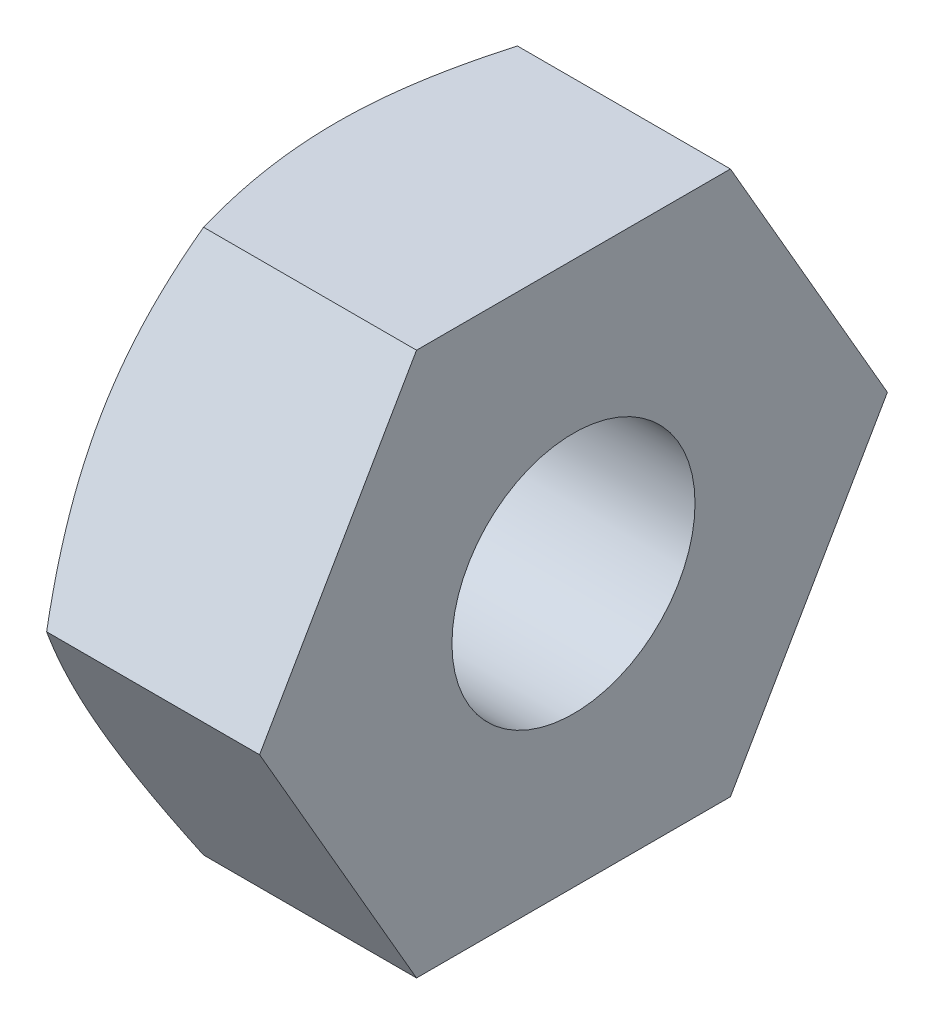
ISO-10303-21;
HEADER;
FILE_DESCRIPTION(('STEP AP214'),'2;1');
FILE_NAME('part.step','',(''),(''),'','','');
FILE_SCHEMA(('AUTOMOTIVE_DESIGN { 1 0 10303 214 1 1 1 1 }'));
ENDSEC;
DATA;
#1=APPLICATION_CONTEXT('core data for automotive mechanical design processes');
#2=APPLICATION_PROTOCOL_DEFINITION('international standard','automotive_design',2000,#1);
#3=PRODUCT_CONTEXT('',#1,'mechanical');
#4=PRODUCT('Part','Part','',(#3));
#5=PRODUCT_RELATED_PRODUCT_CATEGORY('part','',(#4));
#6=PRODUCT_DEFINITION_FORMATION('','',#4);
#7=PRODUCT_DEFINITION_CONTEXT('part definition',#1,'design');
#8=PRODUCT_DEFINITION('design','',#6,#7);
#9=PRODUCT_DEFINITION_SHAPE('','',#8);
#10=(LENGTH_UNIT() NAMED_UNIT(*) SI_UNIT(.MILLI.,.METRE.));
#11=(NAMED_UNIT(*) PLANE_ANGLE_UNIT() SI_UNIT($,.RADIAN.));
#12=(NAMED_UNIT(*) SI_UNIT($,.STERADIAN.) SOLID_ANGLE_UNIT());
#13=UNCERTAINTY_MEASURE_WITH_UNIT(LENGTH_MEASURE(1.E-05),#10,'distance_accuracy_value','');
#14=(GEOMETRIC_REPRESENTATION_CONTEXT(3) GLOBAL_UNCERTAINTY_ASSIGNED_CONTEXT((#13)) GLOBAL_UNIT_ASSIGNED_CONTEXT((#10,
#11,#12)) REPRESENTATION_CONTEXT('',''));
#15=CARTESIAN_POINT('',(0.,0.,0.));
#16=DIRECTION('',(0.,0.,1.));
#17=DIRECTION('',(1.,0.,0.));
#18=AXIS2_PLACEMENT_3D('',#15,#16,#17);
#19=CARTESIAN_POINT('',(-2.4,-2.75,-1.58771324027147));
#20=DIRECTION('',(0.,-0.5,-0.866025403784439));
#21=DIRECTION('',(0.,0.866025403784439,-0.5));
#22=AXIS2_PLACEMENT_3D('',#19,#20,#21);
#23=PLANE('',#22);
#24=DIRECTION('',(1.,0.,0.));
#25=VECTOR('',#24,1.);
#26=CARTESIAN_POINT('',(-2.4,-2.75,-1.58771324027147));
#27=LINE('',#26,#25);
#28=CARTESIAN_POINT('',(-2.15437990693814,-2.75,-1.58771324027147));
#29=VERTEX_POINT('',#28);
#30=CARTESIAN_POINT('',(0.,-2.75,-1.58771324027147));
#31=VERTEX_POINT('',#30);
#32=EDGE_CURVE('E110',#29,#31,#27,.T.);
#33=ORIENTED_EDGE('',*,*,#32,.F.);
#34=CARTESIAN_POINT('',(-2.15431323663524,-2.7502,-1.58759777021763));
#35=CARTESIAN_POINT('',(-2.19461233775074,-2.62935077934009,-1.65737010029699));
#36=CARTESIAN_POINT('',(-2.23126309740234,-2.50745839737736,-1.72774469983533));
#37=CARTESIAN_POINT('',(-2.2952378170302,-2.26156287327211,-1.86971254687003));
#38=CARTESIAN_POINT('',(-2.3225391443255,-2.13755536142614,-1.94130831721583));
#39=CARTESIAN_POINT('',(-2.36503825470588,-1.89107720202405,-2.08361254889599));
#40=CARTESIAN_POINT('',(-2.38051888137754,-1.76864448141258,-2.15429911309864));
#41=CARTESIAN_POINT('',(-2.39900060263006,-1.52320285763108,-2.29600490065923));
#42=CARTESIAN_POINT('',(-2.4020170005374,-1.40019484676709,-2.36702360884404));
#43=CARTESIAN_POINT('',(-2.39574685457145,-1.17034121338921,-2.49972966594897));
#44=CARTESIAN_POINT('',(-2.3879998457233,-1.06346120874598,-2.56143686540073));
#45=CARTESIAN_POINT('',(-2.36344481893564,-0.850397532665249,-2.68444923614047));
#46=CARTESIAN_POINT('',(-2.34662841034943,-0.74421459835111,-2.74575398185008));
#47=CARTESIAN_POINT('',(-2.30458807765404,-0.530711510606816,-2.86902004703206));
#48=CARTESIAN_POINT('',(-2.27918591931277,-0.423418383857145,-2.93096576264318));
#49=CARTESIAN_POINT('',(-2.22153277416002,-0.21043252071595,-3.05393320806134));
#50=CARTESIAN_POINT('',(-2.18929533670102,-0.104737054973349,-3.11495651365995));
#51=CARTESIAN_POINT('',(-2.15431323663524,0.000199999999998433,-3.17554195059678));
#52=B_SPLINE_CURVE_WITH_KNOTS('',3,(#34,#35,#36,#37,#38,#39,#40,#41,#42,#43,#44,#45,#46,#47,#48,
#49,#50,#51),.UNSPECIFIED.,.F.,.F.,(4,2,2,2,2,2,2,2,4),(0.,0.435912828725888,0.872873557116332,
1.29901931904671,1.72464171213574,2.09526089052937,2.46622354066374,2.84541551798557,
3.22386274754524),.UNSPECIFIED.);
#53=CARTESIAN_POINT('',(-2.4,-1.375,-2.38156986040721));
#54=VERTEX_POINT('',#53);
#55=EDGE_CURVE('E196',#29,#54,#52,.T.);
#56=ORIENTED_EDGE('',*,*,#55,.T.);
#57=CARTESIAN_POINT('',(-2.15437990693814,0.,-3.17542648054294));
#58=VERTEX_POINT('',#57);
#59=EDGE_CURVE('E105',#54,#58,#52,.T.);
#60=ORIENTED_EDGE('',*,*,#59,.T.);
#61=DIRECTION('',(1.,0.,0.));
#62=VECTOR('',#61,1.);
#63=CARTESIAN_POINT('',(-2.4,0.,-3.17542648054294));
#64=LINE('',#63,#62);
#65=CARTESIAN_POINT('',(0.,0.,-3.17542648054294));
#66=VERTEX_POINT('',#65);
#67=EDGE_CURVE('E116',#58,#66,#64,.T.);
#68=ORIENTED_EDGE('',*,*,#67,.T.);
#69=DIRECTION('',(0.,0.866025403784439,-0.5));
#70=VECTOR('',#69,1.);
#71=CARTESIAN_POINT('',(0.,-2.75,-1.58771324027147));
#72=LINE('',#71,#70);
#73=EDGE_CURVE('E198',#31,#66,#72,.T.);
#74=ORIENTED_EDGE('',*,*,#73,.F.);
#75=EDGE_LOOP('',(#33,#56,#60,#68,#74));
#76=FACE_BOUND('',#75,.T.);
#77=ADVANCED_FACE('F16',(#76),#23,.T.);
#78=CARTESIAN_POINT('',(-2.4,-2.75,1.58771324027147));
#79=DIRECTION('',(0.,-1.,0.));
#80=DIRECTION('',(0.,0.,-1.));
#81=AXIS2_PLACEMENT_3D('',#78,#79,#80);
#82=PLANE('',#81);
#83=DIRECTION('',(1.,0.,0.));
#84=VECTOR('',#83,1.);
#85=CARTESIAN_POINT('',(-2.4,-2.75,1.58771324027147));
#86=LINE('',#85,#84);
#87=CARTESIAN_POINT('',(-2.15437990693814,-2.75,1.58771324027147));
#88=VERTEX_POINT('',#87);
#89=CARTESIAN_POINT('',(0.,-2.75,1.58771324027147));
#90=VERTEX_POINT('',#89);
#91=EDGE_CURVE('E202',#88,#90,#86,.T.);
#92=ORIENTED_EDGE('',*,*,#91,.F.);
#93=CARTESIAN_POINT('',(-1.01906346251006,-2.75,-4.34466851543462));
#94=CARTESIAN_POINT('',(-1.0779876331717,-2.75,-4.22385079939018));
#95=CARTESIAN_POINT('',(-1.1363694090951,-2.75,-4.10276414165626));
#96=CARTESIAN_POINT('',(-1.25174458609081,-2.75,-3.85991018623847));
#97=CARTESIAN_POINT('',(-1.30873778289699,-2.75,-3.73814279161582));
#98=CARTESIAN_POINT('',(-1.42130202551264,-2.75,-3.49319484525536));
#99=CARTESIAN_POINT('',(-1.47686430318246,-2.75,-3.37001025082041));
#100=CARTESIAN_POINT('',(-1.5858189035652,-2.75,-3.12268868126982));
#101=CARTESIAN_POINT('',(-1.63921132378874,-2.75,-2.9985517492497));
#102=CARTESIAN_POINT('',(-1.7450381311811,-2.75,-2.74485564747554));
#103=CARTESIAN_POINT('',(-1.79737701109295,-2.75,-2.61525642785055));
#104=CARTESIAN_POINT('',(-1.89828349353265,-2.75,-2.35457157994024));
#105=CARTESIAN_POINT('',(-1.94685068429454,-2.75,-2.22348579114728));
#106=CARTESIAN_POINT('',(-2.03899719110964,-2.75,-1.95983972525272));
#107=CARTESIAN_POINT('',(-2.08258594462744,-2.75,-1.82728277880184));
#108=CARTESIAN_POINT('',(-2.16343007280605,-2.75,-1.5602690233694));
#109=CARTESIAN_POINT('',(-2.20068735922314,-2.75,-1.42581280119396));
#110=CARTESIAN_POINT('',(-2.26693538105468,-2.75,-1.15567164709611));
#111=CARTESIAN_POINT('',(-2.2959729022741,-2.75,-1.01999839797026));
#112=CARTESIAN_POINT('',(-2.34419375257911,-2.75,-0.74688426077907));
#113=CARTESIAN_POINT('',(-2.363378172959,-2.75,-0.609443570198374));
#114=CARTESIAN_POINT('',(-2.39011561843286,-2.75,-0.335307664003908));
#115=CARTESIAN_POINT('',(-2.39782435113278,-2.75,-0.198628020264006));
#116=CARTESIAN_POINT('',(-2.40137226248779,-2.75,0.0749004883116841));
#117=CARTESIAN_POINT('',(-2.39721129594968,-2.75,0.211749355196985));
#118=CARTESIAN_POINT('',(-2.38054455811678,-2.75,0.441745716108567));
#119=CARTESIAN_POINT('',(-2.37106793062296,-2.75,0.535128006208924));
#120=CARTESIAN_POINT('',(-2.34713569884465,-2.75,0.721256530288206));
#121=CARTESIAN_POINT('',(-2.33267948471256,-2.75,0.814002684940313));
#122=CARTESIAN_POINT('',(-2.28259645749455,-2.75,1.09113429581591));
#123=CARTESIAN_POINT('',(-2.24026261675864,-2.75,1.27432378334125));
#124=CARTESIAN_POINT('',(-2.16623639213029,-2.75,1.54840967764348));
#125=CARTESIAN_POINT('',(-2.13943637674444,-2.75,1.64070877548221));
#126=CARTESIAN_POINT('',(-2.08289976209021,-2.75,1.8244119062789));
#127=CARTESIAN_POINT('',(-2.0531631396959,-2.75,1.9158159321819));
#128=CARTESIAN_POINT('',(-1.991243101734,-2.75,2.09775609342734));
#129=CARTESIAN_POINT('',(-1.95906035016729,-2.75,2.18829245683532));
#130=CARTESIAN_POINT('',(-1.8926418963021,-2.75,2.36860392965098));
#131=CARTESIAN_POINT('',(-1.85840624421816,-2.75,2.45837905761742));
#132=CARTESIAN_POINT('',(-1.76224972200466,-2.75,2.70344903830686));
#133=CARTESIAN_POINT('',(-1.69859130450209,-2.75,2.858061559114));
#134=CARTESIAN_POINT('',(-1.56744039754863,-2.75,3.16565801724111));
#135=CARTESIAN_POINT('',(-1.49994745304508,-2.75,3.31864175870119));
#136=CARTESIAN_POINT('',(-1.36205394750439,-2.75,3.62335709957491));
#137=CARTESIAN_POINT('',(-1.29165231756389,-2.75,3.77508821364154));
#138=CARTESIAN_POINT('',(-1.14863671256358,-2.75,4.07750624826607));
#139=CARTESIAN_POINT('',(-1.07602266650824,-2.75,4.22819313512429));
#140=CARTESIAN_POINT('',(-0.855389682042385,-2.75,4.67949745993608));
#141=CARTESIAN_POINT('',(-0.704809359853885,-2.75,4.97886094179878));
#142=CARTESIAN_POINT('',(-0.399406350084823,-2.75,5.57531417757658));
#143=CARTESIAN_POINT('',(-0.244584616252627,-2.75,5.87240442375158));
#144=CARTESIAN_POINT('',(0.0509886887618314,-2.75,6.43291315345723));
#145=CARTESIAN_POINT('',(0.191444454601984,-2.75,6.69648788989422));
#146=CARTESIAN_POINT('',(0.4740290388714,-2.75,7.22275982976358));
#147=CARTESIAN_POINT('',(0.616157966920033,-2.75,7.48545697423556));
#148=CARTESIAN_POINT('',(0.901156062896541,-2.75,8.0092636460504));
#149=CARTESIAN_POINT('',(1.04402092961554,-2.75,8.27037551638421));
#150=CARTESIAN_POINT('',(1.33069625241297,-2.75,8.79205167142182));
#151=CARTESIAN_POINT('',(1.47450662906904,-2.75,9.05261599975264));
#152=CARTESIAN_POINT('',(1.61866007822155,-2.75,9.31298906683199));
#153=B_SPLINE_CURVE_WITH_KNOTS('',3,(#93,#94,#95,#96,#97,#98,#99,#100,#101,#102,#103,#104,#105,
#106,#107,#108,#109,#110,#111,#112,#113,#114,#115,#116,#117,#118,#119,#120,#121,#122,#123,#124,
#125,#126,#127,#128,#129,#130,#131,#132,#133,#134,#135,#136,#137,#138,#139,#140,#141,#142,#143,
#144,#145,#146,#147,#148,#149,#150,#151,#152),.UNSPECIFIED.,.F.,.F.,(4,2,2,2,2,2,2,2,2,2,2,2,2,
2,2,2,2,2,2,2,2,2,2,2,2,2,2,2,2,4),(0.,0.403267258208561,0.806593484951441,1.21198327071312,
1.61735481858882,2.03661578473809,2.45592245863436,2.87442058913527,3.29279213073204,
3.70873214300742,4.12462607731107,4.53482382951448,4.94502659938344,5.22647734467154,
5.50796257136057,6.07120005119647,6.35950697794161,6.64781617529997,6.93604738882539,
7.22427155500536,7.72580757069955,8.22740322972459,8.72918488725591,9.23098266374803,
10.2362216951868,11.2412365087129,12.1372165918082,13.0332557065488,13.926174566331,
14.8190193559892),.UNSPECIFIED.);
#154=CARTESIAN_POINT('',(-2.4,-2.75,0.));
#155=VERTEX_POINT('',#154);
#156=EDGE_CURVE('E233',#88,#155,#153,.F.);
#157=ORIENTED_EDGE('',*,*,#156,.T.);
#158=EDGE_CURVE('E166',#155,#29,#153,.F.);
#159=ORIENTED_EDGE('',*,*,#158,.T.);
#160=ORIENTED_EDGE('',*,*,#32,.T.);
#161=DIRECTION('',(0.,0.,-1.));
#162=VECTOR('',#161,1.);
#163=CARTESIAN_POINT('',(0.,-2.75,1.58771324027147));
#164=LINE('',#163,#162);
#165=EDGE_CURVE('E207',#90,#31,#164,.T.);
#166=ORIENTED_EDGE('',*,*,#165,.F.);
#167=EDGE_LOOP('',(#92,#157,#159,#160,#166));
#168=FACE_BOUND('',#167,.T.);
#169=ADVANCED_FACE('F188',(#168),#82,.T.);
#170=CARTESIAN_POINT('',(-2.4,0.,3.17542648054294));
#171=DIRECTION('',(0.,-0.5,0.866025403784438));
#172=DIRECTION('',(0.,-0.866025403784439,-0.5));
#173=AXIS2_PLACEMENT_3D('',#170,#171,#172);
#174=PLANE('',#173);
#175=DIRECTION('',(1.,0.,0.));
#176=VECTOR('',#175,1.);
#177=CARTESIAN_POINT('',(-2.4,0.,3.17542648054294));
#178=LINE('',#177,#176);
#179=CARTESIAN_POINT('',(-2.15437990693814,0.,3.17542648054294));
#180=VERTEX_POINT('',#179);
#181=CARTESIAN_POINT('',(0.,0.,3.17542648054294));
#182=VERTEX_POINT('',#181);
#183=EDGE_CURVE('E204',#180,#182,#178,.T.);
#184=ORIENTED_EDGE('',*,*,#183,.F.);
#185=CARTESIAN_POINT('',(-2.15431323663524,0.000200000000001251,3.17554195059678));
#186=CARTESIAN_POINT('',(-2.19461233775074,-0.120649220659905,3.10576962051743));
#187=CARTESIAN_POINT('',(-2.23126309740234,-0.242541602622633,3.03539502097908));
#188=CARTESIAN_POINT('',(-2.2952378170302,-0.488437126727892,2.89342717394439));
#189=CARTESIAN_POINT('',(-2.3225391443255,-0.612444638573854,2.82183140359858));
#190=CARTESIAN_POINT('',(-2.36503825470588,-0.858922797975943,2.67952717191842));
#191=CARTESIAN_POINT('',(-2.38051888137754,-0.981355518587416,2.60884060771577));
#192=CARTESIAN_POINT('',(-2.39900060263006,-1.22679714236891,2.46713482015519));
#193=CARTESIAN_POINT('',(-2.4020170005374,-1.34980515323291,2.39611611197038));
#194=CARTESIAN_POINT('',(-2.39574685457145,-1.57965878661079,2.26341005486544));
#195=CARTESIAN_POINT('',(-2.3879998457233,-1.68653879125402,2.20170285541369));
#196=CARTESIAN_POINT('',(-2.36344481893565,-1.89960246733475,2.07869048467395));
#197=CARTESIAN_POINT('',(-2.34662841034943,-2.00578540164889,2.01738573896433));
#198=CARTESIAN_POINT('',(-2.30458807765404,-2.21928848939318,1.89411967378235));
#199=CARTESIAN_POINT('',(-2.27918591931277,-2.32658161614285,1.83217395817123));
#200=CARTESIAN_POINT('',(-2.22153277416002,-2.53956747928405,1.70920651275308));
#201=CARTESIAN_POINT('',(-2.18929533670102,-2.64526294502665,1.64818320715446));
#202=CARTESIAN_POINT('',(-2.15431323663524,-2.7502,1.58759777021763));
#203=B_SPLINE_CURVE_WITH_KNOTS('',3,(#185,#186,#187,#188,#189,#190,#191,#192,#193,#194,#195,
#196,#197,#198,#199,#200,#201,#202),.UNSPECIFIED.,.F.,.F.,(4,2,2,2,2,2,2,2,4),(0.,
0.435912828725888,0.872873557116333,1.29901931904672,1.72464171213574,2.09526089052938,
2.46622354066374,2.84541551798557,3.22386274754524),.UNSPECIFIED.);
#204=CARTESIAN_POINT('',(-2.4,-1.375,2.38156986040721));
#205=VERTEX_POINT('',#204);
#206=EDGE_CURVE('E227',#180,#205,#203,.T.);
#207=ORIENTED_EDGE('',*,*,#206,.T.);
#208=EDGE_CURVE('E143',#205,#88,#203,.T.);
#209=ORIENTED_EDGE('',*,*,#208,.T.);
#210=ORIENTED_EDGE('',*,*,#91,.T.);
#211=DIRECTION('',(0.,-0.866025403784438,-0.5));
#212=VECTOR('',#211,1.);
#213=CARTESIAN_POINT('',(0.,0.,3.17542648054294));
#214=LINE('',#213,#212);
#215=EDGE_CURVE('E214',#182,#90,#214,.T.);
#216=ORIENTED_EDGE('',*,*,#215,.F.);
#217=EDGE_LOOP('',(#184,#207,#209,#210,#216));
#218=FACE_BOUND('',#217,.T.);
#219=ADVANCED_FACE('F176',(#218),#174,.T.);
#220=CARTESIAN_POINT('',(-2.4,2.75,1.58771324027147));
#221=DIRECTION('',(0.,0.5,0.866025403784439));
#222=DIRECTION('',(0.,-0.866025403784439,0.5));
#223=AXIS2_PLACEMENT_3D('',#220,#221,#222);
#224=PLANE('',#223);
#225=DIRECTION('',(1.,0.,0.));
#226=VECTOR('',#225,1.);
#227=CARTESIAN_POINT('',(-2.4,2.75,1.58771324027147));
#228=LINE('',#227,#226);
#229=CARTESIAN_POINT('',(-2.15437990693814,2.75,1.58771324027147));
#230=VERTEX_POINT('',#229);
#231=CARTESIAN_POINT('',(0.,2.75,1.58771324027147));
#232=VERTEX_POINT('',#231);
#233=EDGE_CURVE('E211',#230,#232,#228,.T.);
#234=ORIENTED_EDGE('',*,*,#233,.F.);
#235=CARTESIAN_POINT('',(-2.15431323663524,2.7502,1.58759777021763));
#236=CARTESIAN_POINT('',(-2.19461233775074,2.62935077934009,1.65737010029699));
#237=CARTESIAN_POINT('',(-2.23126309740234,2.50745839737737,1.72774469983533));
#238=CARTESIAN_POINT('',(-2.2952378170302,2.26156287327211,1.86971254687003));
#239=CARTESIAN_POINT('',(-2.3225391443255,2.13755536142614,1.94130831721583));
#240=CARTESIAN_POINT('',(-2.36503825470588,1.89107720202406,2.08361254889599));
#241=CARTESIAN_POINT('',(-2.38051888137754,1.76864448141258,2.15429911309864));
#242=CARTESIAN_POINT('',(-2.39900060263006,1.52320285763108,2.29600490065923));
#243=CARTESIAN_POINT('',(-2.4020170005374,1.40019484676709,2.36702360884404));
#244=CARTESIAN_POINT('',(-2.39574685457145,1.17034121338921,2.49972966594897));
#245=CARTESIAN_POINT('',(-2.3879998457233,1.06346120874598,2.56143686540073));
#246=CARTESIAN_POINT('',(-2.36344481893565,0.850397532665251,2.68444923614047));
#247=CARTESIAN_POINT('',(-2.34662841034943,0.744214598351111,2.74575398185008));
#248=CARTESIAN_POINT('',(-2.30458807765404,0.530711510606817,2.86902004703206));
#249=CARTESIAN_POINT('',(-2.27918591931277,0.423418383857146,2.93096576264318));
#250=CARTESIAN_POINT('',(-2.22153277416002,0.21043252071595,3.05393320806134));
#251=CARTESIAN_POINT('',(-2.18929533670102,0.104737054973348,3.11495651365995));
#252=CARTESIAN_POINT('',(-2.15431323663524,-0.000199999999999263,3.17554195059678));
#253=B_SPLINE_CURVE_WITH_KNOTS('',3,(#235,#236,#237,#238,#239,#240,#241,#242,#243,#244,#245,
#246,#247,#248,#249,#250,#251,#252),.UNSPECIFIED.,.F.,.F.,(4,2,2,2,2,2,2,2,4),(0.,
0.435912828725889,0.872873557116333,1.29901931904672,1.72464171213574,2.09526089052938,
2.46622354066374,2.84541551798557,3.22386274754524),.UNSPECIFIED.);
#254=CARTESIAN_POINT('',(-2.4,1.375,2.38156986040721));
#255=VERTEX_POINT('',#254);
#256=EDGE_CURVE('E159',#230,#255,#253,.T.);
#257=ORIENTED_EDGE('',*,*,#256,.T.);
#258=EDGE_CURVE('E39',#255,#180,#253,.T.);
#259=ORIENTED_EDGE('',*,*,#258,.T.);
#260=ORIENTED_EDGE('',*,*,#183,.T.);
#261=DIRECTION('',(0.,-0.866025403784439,0.5));
#262=VECTOR('',#261,1.);
#263=CARTESIAN_POINT('',(0.,2.75,1.58771324027147));
#264=LINE('',#263,#262);
#265=EDGE_CURVE('E217',#232,#182,#264,.T.);
#266=ORIENTED_EDGE('',*,*,#265,.F.);
#267=EDGE_LOOP('',(#234,#257,#259,#260,#266));
#268=FACE_BOUND('',#267,.T.);
#269=ADVANCED_FACE('F172',(#268),#224,.T.);
#270=CARTESIAN_POINT('',(-2.4,2.75,-1.58771324027147));
#271=DIRECTION('',(0.,1.,0.));
#272=DIRECTION('',(0.,0.,1.));
#273=AXIS2_PLACEMENT_3D('',#270,#271,#272);
#274=PLANE('',#273);
#275=DIRECTION('',(1.,0.,0.));
#276=VECTOR('',#275,1.);
#277=CARTESIAN_POINT('',(-2.4,2.75,-1.58771324027147));
#278=LINE('',#277,#276);
#279=CARTESIAN_POINT('',(-2.15437990693814,2.75,-1.58771324027147));
#280=VERTEX_POINT('',#279);
#281=CARTESIAN_POINT('',(0.,2.75,-1.58771324027147));
#282=VERTEX_POINT('',#281);
#283=EDGE_CURVE('E213',#280,#282,#278,.T.);
#284=ORIENTED_EDGE('',*,*,#283,.F.);
#285=CARTESIAN_POINT('',(-1.01906346251006,2.75,-4.34466851543462));
#286=CARTESIAN_POINT('',(-1.0779876331717,2.75,-4.22385079939017));
#287=CARTESIAN_POINT('',(-1.1363694090951,2.75,-4.10276414165625));
#288=CARTESIAN_POINT('',(-1.25174458609081,2.75,-3.85991018623846));
#289=CARTESIAN_POINT('',(-1.30873778289699,2.75,-3.73814279161582));
#290=CARTESIAN_POINT('',(-1.42130202551264,2.75,-3.49319484525536));
#291=CARTESIAN_POINT('',(-1.47686430318246,2.75,-3.37001025082041));
#292=CARTESIAN_POINT('',(-1.5858189035652,2.75,-3.12268868126982));
#293=CARTESIAN_POINT('',(-1.63921132378874,2.75,-2.9985517492497));
#294=CARTESIAN_POINT('',(-1.7450381311811,2.75,-2.74485564747553));
#295=CARTESIAN_POINT('',(-1.79737701109295,2.75,-2.61525642785054));
#296=CARTESIAN_POINT('',(-1.89828349353266,2.75,-2.35457157994024));
#297=CARTESIAN_POINT('',(-1.94685068429454,2.75,-2.22348579114727));
#298=CARTESIAN_POINT('',(-2.03899719110964,2.75,-1.95983972525272));
#299=CARTESIAN_POINT('',(-2.08258594462744,2.75,-1.82728277880183));
#300=CARTESIAN_POINT('',(-2.16343007280605,2.75,-1.56026902336939));
#301=CARTESIAN_POINT('',(-2.20068735922314,2.75,-1.42581280119396));
#302=CARTESIAN_POINT('',(-2.26693538105468,2.75,-1.15567164709611));
#303=CARTESIAN_POINT('',(-2.2959729022741,2.75,-1.01999839797026));
#304=CARTESIAN_POINT('',(-2.34419375257911,2.75,-0.746884260779065));
#305=CARTESIAN_POINT('',(-2.363378172959,2.75,-0.609443570198369));
#306=CARTESIAN_POINT('',(-2.39011561843285,2.75,-0.335307664003903));
#307=CARTESIAN_POINT('',(-2.39782435113277,2.75,-0.198628020264001));
#308=CARTESIAN_POINT('',(-2.40137226248779,2.75,0.0749004883116892));
#309=CARTESIAN_POINT('',(-2.39721129594967,2.75,0.21174935519699));
#310=CARTESIAN_POINT('',(-2.38054455811678,2.75,0.441745716108572));
#311=CARTESIAN_POINT('',(-2.37106793062296,2.75,0.535128006208929));
#312=CARTESIAN_POINT('',(-2.34713569884465,2.75,0.721256530288212));
#313=CARTESIAN_POINT('',(-2.33267948471256,2.75,0.814002684940319));
#314=CARTESIAN_POINT('',(-2.28259645749455,2.75,1.09113429581592));
#315=CARTESIAN_POINT('',(-2.24026261675864,2.75,1.27432378334125));
#316=CARTESIAN_POINT('',(-2.16623639213029,2.75,1.54840967764348));
#317=CARTESIAN_POINT('',(-2.13943637674443,2.75,1.64070877548221));
#318=CARTESIAN_POINT('',(-2.0828997620902,2.75,1.82441190627891));
#319=CARTESIAN_POINT('',(-2.0531631396959,2.75,1.9158159321819));
#320=CARTESIAN_POINT('',(-1.99124310173399,2.75,2.09775609342735));
#321=CARTESIAN_POINT('',(-1.95906035016728,2.75,2.18829245683533));
#322=CARTESIAN_POINT('',(-1.89264189630209,2.75,2.36860392965098));
#323=CARTESIAN_POINT('',(-1.85840624421816,2.75,2.45837905761743));
#324=CARTESIAN_POINT('',(-1.76224972200466,2.75,2.70344903830687));
#325=CARTESIAN_POINT('',(-1.69859130450209,2.75,2.85806155911401));
#326=CARTESIAN_POINT('',(-1.56744039754863,2.75,3.16565801724112));
#327=CARTESIAN_POINT('',(-1.49994745304507,2.75,3.3186417587012));
#328=CARTESIAN_POINT('',(-1.36205394750439,2.75,3.62335709957492));
#329=CARTESIAN_POINT('',(-1.29165231756389,2.75,3.77508821364155));
#330=CARTESIAN_POINT('',(-1.14863671256357,2.75,4.07750624826608));
#331=CARTESIAN_POINT('',(-1.07602266650823,2.75,4.2281931351243));
#332=CARTESIAN_POINT('',(-0.855389682042378,2.75,4.67949745993609));
#333=CARTESIAN_POINT('',(-0.70480935985388,2.75,4.97886094179879));
#334=CARTESIAN_POINT('',(-0.399406350084818,2.75,5.57531417757659));
#335=CARTESIAN_POINT('',(-0.244584616252622,2.75,5.87240442375159));
#336=CARTESIAN_POINT('',(0.0509886887618365,2.75,6.43291315345724));
#337=CARTESIAN_POINT('',(0.191444454601989,2.75,6.69648788989423));
#338=CARTESIAN_POINT('',(0.474029038871404,2.75,7.22275982976359));
#339=CARTESIAN_POINT('',(0.616157966920037,2.75,7.48545697423557));
#340=CARTESIAN_POINT('',(0.901156062896545,2.75,8.00926364605041));
#341=CARTESIAN_POINT('',(1.04402092961554,2.75,8.27037551638421));
#342=CARTESIAN_POINT('',(1.33069625241298,2.75,8.79205167142182));
#343=CARTESIAN_POINT('',(1.47450662906904,2.75,9.05261599975264));
#344=CARTESIAN_POINT('',(1.61866007822155,2.75,9.31298906683199));
#345=B_SPLINE_CURVE_WITH_KNOTS('',3,(#285,#286,#287,#288,#289,#290,#291,#292,#293,#294,#295,
#296,#297,#298,#299,#300,#301,#302,#303,#304,#305,#306,#307,#308,#309,#310,#311,#312,#313,#314,
#315,#316,#317,#318,#319,#320,#321,#322,#323,#324,#325,#326,#327,#328,#329,#330,#331,#332,#333,
#334,#335,#336,#337,#338,#339,#340,#341,#342,#343,#344),.UNSPECIFIED.,.F.,.F.,(4,2,2,2,2,2,2,2,
2,2,2,2,2,2,2,2,2,2,2,2,2,2,2,2,2,2,2,2,2,4),(0.,0.403267258208563,0.806593484951441,
1.21198327071312,1.61735481858882,2.03661578473809,2.45592245863436,2.87442058913527,
3.29279213073204,3.70873214300742,4.12462607731107,4.53482382951448,4.94502659938344,
5.22647734467154,5.50796257136057,6.07120005119648,6.35950697794161,6.64781617529997,
6.93604738882539,7.22427155500537,7.72580757069955,8.2274032297246,8.72918488725591,
9.23098266374804,10.2362216951868,11.2412365087129,12.1372165918082,13.0332557065488,
13.926174566331,14.8190193559892),.UNSPECIFIED.);
#346=CARTESIAN_POINT('',(-2.4,2.75,0.));
#347=VERTEX_POINT('',#346);
#348=EDGE_CURVE('E93',#280,#347,#345,.T.);
#349=ORIENTED_EDGE('',*,*,#348,.T.);
#350=EDGE_CURVE('E32',#347,#230,#345,.T.);
#351=ORIENTED_EDGE('',*,*,#350,.T.);
#352=ORIENTED_EDGE('',*,*,#233,.T.);
#353=DIRECTION('',(0.,0.,1.));
#354=VECTOR('',#353,1.);
#355=CARTESIAN_POINT('',(0.,2.75,-1.58771324027147));
#356=LINE('',#355,#354);
#357=EDGE_CURVE('E220',#282,#232,#356,.T.);
#358=ORIENTED_EDGE('',*,*,#357,.F.);
#359=EDGE_LOOP('',(#284,#349,#351,#352,#358));
#360=FACE_BOUND('',#359,.T.);
#361=ADVANCED_FACE('F175',(#360),#274,.T.);
#362=CARTESIAN_POINT('',(-2.4,0.,-3.17542648054294));
#363=DIRECTION('',(0.,0.5,-0.866025403784438));
#364=DIRECTION('',(0.,0.866025403784439,0.5));
#365=AXIS2_PLACEMENT_3D('',#362,#363,#364);
#366=PLANE('',#365);
#367=ORIENTED_EDGE('',*,*,#67,.F.);
#368=CARTESIAN_POINT('',(-2.15431323663524,-0.000200000000001714,-3.17554195059678));
#369=CARTESIAN_POINT('',(-2.19461233775074,0.120649220659904,-3.10576962051743));
#370=CARTESIAN_POINT('',(-2.23126309740234,0.242541602622632,-3.03539502097908));
#371=CARTESIAN_POINT('',(-2.2952378170302,0.488437126727891,-2.89342717394439));
#372=CARTESIAN_POINT('',(-2.3225391443255,0.612444638573854,-2.82183140359858));
#373=CARTESIAN_POINT('',(-2.36503825470588,0.858922797975942,-2.67952717191842));
#374=CARTESIAN_POINT('',(-2.38051888137754,0.981355518587415,-2.60884060771577));
#375=CARTESIAN_POINT('',(-2.39900060263006,1.22679714236891,-2.46713482015518));
#376=CARTESIAN_POINT('',(-2.4020170005374,1.34980515323291,-2.39611611197037));
#377=CARTESIAN_POINT('',(-2.39574685457145,1.57965878661079,-2.26341005486544));
#378=CARTESIAN_POINT('',(-2.3879998457233,1.68653879125402,-2.20170285541369));
#379=CARTESIAN_POINT('',(-2.36344481893565,1.89960246733475,-2.07869048467395));
#380=CARTESIAN_POINT('',(-2.34662841034943,2.00578540164889,-2.01738573896433));
#381=CARTESIAN_POINT('',(-2.30458807765405,2.21928848939318,-1.89411967378235));
#382=CARTESIAN_POINT('',(-2.27918591931277,2.32658161614285,-1.83217395817123));
#383=CARTESIAN_POINT('',(-2.22153277416002,2.53956747928405,-1.70920651275307));
#384=CARTESIAN_POINT('',(-2.18929533670102,2.64526294502665,-1.64818320715446));
#385=CARTESIAN_POINT('',(-2.15431323663524,2.7502,-1.58759777021763));
#386=B_SPLINE_CURVE_WITH_KNOTS('',3,(#368,#369,#370,#371,#372,#373,#374,#375,#376,#377,#378,
#379,#380,#381,#382,#383,#384,#385),.UNSPECIFIED.,.F.,.F.,(4,2,2,2,2,2,2,2,4),(0.,
0.435912828725888,0.872873557116332,1.29901931904672,1.72464171213574,2.09526089052938,
2.46622354066374,2.84541551798557,3.22386274754525),.UNSPECIFIED.);
#387=CARTESIAN_POINT('',(-2.4,1.375,-2.38156986040721));
#388=VERTEX_POINT('',#387);
#389=EDGE_CURVE('E97',#58,#388,#386,.T.);
#390=ORIENTED_EDGE('',*,*,#389,.T.);
#391=EDGE_CURVE('E87',#388,#280,#386,.T.);
#392=ORIENTED_EDGE('',*,*,#391,.T.);
#393=ORIENTED_EDGE('',*,*,#283,.T.);
#394=DIRECTION('',(0.,0.866025403784438,0.5));
#395=VECTOR('',#394,1.);
#396=CARTESIAN_POINT('',(0.,0.,-3.17542648054294));
#397=LINE('',#396,#395);
#398=EDGE_CURVE('E225',#66,#282,#397,.T.);
#399=ORIENTED_EDGE('',*,*,#398,.F.);
#400=EDGE_LOOP('',(#367,#390,#392,#393,#399));
#401=FACE_BOUND('',#400,.T.);
#402=ADVANCED_FACE('F114',(#401),#366,.T.);
#403=CARTESIAN_POINT('',(0.,0.,0.));
#404=DIRECTION('',(1.,0.,0.));
#405=DIRECTION('',(0.,0.,-1.));
#406=AXIS2_PLACEMENT_3D('',#403,#404,#405);
#407=PLANE('',#406);
#408=CARTESIAN_POINT('',(0.,0.,0.));
#409=DIRECTION('',(1.,0.,0.));
#410=DIRECTION('',(0.,0.,-1.));
#411=AXIS2_PLACEMENT_3D('',#408,#409,#410);
#412=CIRCLE('',#411,1.2295);
#413=CARTESIAN_POINT('',(0.,0.,-1.2295));
#414=VERTEX_POINT('',#413);
#415=EDGE_CURVE('E353',#414,#414,#412,.T.);
#416=ORIENTED_EDGE('',*,*,#415,.F.);
#417=EDGE_LOOP('',(#416));
#418=FACE_BOUND('',#417,.T.);
#419=ORIENTED_EDGE('',*,*,#73,.T.);
#420=ORIENTED_EDGE('',*,*,#398,.T.);
#421=ORIENTED_EDGE('',*,*,#357,.T.);
#422=ORIENTED_EDGE('',*,*,#265,.T.);
#423=ORIENTED_EDGE('',*,*,#215,.T.);
#424=ORIENTED_EDGE('',*,*,#165,.T.);
#425=EDGE_LOOP('',(#419,#420,#421,#422,#423,#424));
#426=FACE_BOUND('',#425,.T.);
#427=ADVANCED_FACE('F186',(#418,#426),#407,.T.);
#428=CARTESIAN_POINT('',(-2.4,0.,0.));
#429=DIRECTION('',(1.,0.,0.));
#430=DIRECTION('',(0.,0.,1.));
#431=AXIS2_PLACEMENT_3D('',#428,#429,#430);
#432=CONICAL_SURFACE('',#431,2.75,1.0471975511966);
#433=CARTESIAN_POINT('',(-2.4,0.,0.));
#434=DIRECTION('',(1.,0.,0.));
#435=DIRECTION('',(0.,0.,-1.));
#436=AXIS2_PLACEMENT_3D('',#433,#434,#435);
#437=CIRCLE('',#436,2.75);
#438=EDGE_CURVE('E20',#54,#388,#437,.T.);
#439=ORIENTED_EDGE('',*,*,#438,.T.);
#440=ORIENTED_EDGE('',*,*,#389,.F.);
#441=ORIENTED_EDGE('',*,*,#59,.F.);
#442=EDGE_LOOP('',(#439,#440,#441));
#443=FACE_BOUND('',#442,.T.);
#444=ADVANCED_FACE('F103',(#443),#432,.T.);
#445=EDGE_CURVE('E109',#155,#54,#437,.T.);
#446=ORIENTED_EDGE('',*,*,#445,.T.);
#447=ORIENTED_EDGE('',*,*,#55,.F.);
#448=ORIENTED_EDGE('',*,*,#158,.F.);
#449=EDGE_LOOP('',(#446,#447,#448));
#450=FACE_BOUND('',#449,.T.);
#451=ADVANCED_FACE('F237',(#450),#432,.T.);
#452=EDGE_CURVE('E240',#205,#155,#437,.T.);
#453=ORIENTED_EDGE('',*,*,#452,.T.);
#454=ORIENTED_EDGE('',*,*,#156,.F.);
#455=ORIENTED_EDGE('',*,*,#208,.F.);
#456=EDGE_LOOP('',(#453,#454,#455));
#457=FACE_BOUND('',#456,.T.);
#458=ADVANCED_FACE('F241',(#457),#432,.T.);
#459=ORIENTED_EDGE('',*,*,#258,.F.);
#460=EDGE_CURVE('E25',#255,#205,#437,.T.);
#461=ORIENTED_EDGE('',*,*,#460,.T.);
#462=ORIENTED_EDGE('',*,*,#206,.F.);
#463=EDGE_LOOP('',(#459,#461,#462));
#464=FACE_BOUND('',#463,.T.);
#465=ADVANCED_FACE('F137',(#464),#432,.T.);
#466=ORIENTED_EDGE('',*,*,#350,.F.);
#467=CARTESIAN_POINT('',(-2.4,0.,0.));
#468=DIRECTION('',(-1.,0.,0.));
#469=DIRECTION('',(0.,0.,1.));
#470=AXIS2_PLACEMENT_3D('',#467,#468,#469);
#471=CIRCLE('',#470,2.75);
#472=EDGE_CURVE('E98',#255,#347,#471,.T.);
#473=ORIENTED_EDGE('',*,*,#472,.F.);
#474=ORIENTED_EDGE('',*,*,#256,.F.);
#475=EDGE_LOOP('',(#466,#473,#474));
#476=FACE_BOUND('',#475,.T.);
#477=ADVANCED_FACE('F136',(#476),#432,.T.);
#478=ORIENTED_EDGE('',*,*,#391,.F.);
#479=EDGE_CURVE('E11',#388,#347,#437,.T.);
#480=ORIENTED_EDGE('',*,*,#479,.T.);
#481=ORIENTED_EDGE('',*,*,#348,.F.);
#482=EDGE_LOOP('',(#478,#480,#481));
#483=FACE_BOUND('',#482,.T.);
#484=ADVANCED_FACE('F89',(#483),#432,.T.);
#485=CARTESIAN_POINT('',(-2.4,0.,0.));
#486=DIRECTION('',(1.,0.,0.));
#487=DIRECTION('',(0.,0.,-1.));
#488=AXIS2_PLACEMENT_3D('',#485,#486,#487);
#489=PLANE('',#488);
#490=CARTESIAN_POINT('',(-2.4,0.,0.));
#491=DIRECTION('',(1.,0.,0.));
#492=DIRECTION('',(0.,0.,-1.));
#493=AXIS2_PLACEMENT_3D('',#490,#491,#492);
#494=CIRCLE('',#493,1.2295);
#495=CARTESIAN_POINT('',(-2.4,0.,-1.2295));
#496=VERTEX_POINT('',#495);
#497=EDGE_CURVE('E350',#496,#496,#494,.T.);
#498=ORIENTED_EDGE('',*,*,#497,.T.);
#499=EDGE_LOOP('',(#498));
#500=FACE_BOUND('',#499,.T.);
#501=ORIENTED_EDGE('',*,*,#479,.F.);
#502=ORIENTED_EDGE('',*,*,#438,.F.);
#503=ORIENTED_EDGE('',*,*,#445,.F.);
#504=ORIENTED_EDGE('',*,*,#452,.F.);
#505=ORIENTED_EDGE('',*,*,#460,.F.);
#506=ORIENTED_EDGE('',*,*,#472,.T.);
#507=EDGE_LOOP('',(#501,#502,#503,#504,#505,#506));
#508=FACE_BOUND('',#507,.T.);
#509=ADVANCED_FACE('F111',(#500,#508),#489,.F.);
#510=CARTESIAN_POINT('',(0.,0.,0.));
#511=DIRECTION('',(1.,0.,0.));
#512=DIRECTION('',(0.,0.,-1.));
#513=AXIS2_PLACEMENT_3D('',#510,#511,#512);
#514=CYLINDRICAL_SURFACE('',#513,1.2295);
#515=ORIENTED_EDGE('',*,*,#497,.F.);
#516=EDGE_LOOP('',(#515));
#517=FACE_BOUND('',#516,.T.);
#518=ORIENTED_EDGE('',*,*,#415,.T.);
#519=EDGE_LOOP('',(#518));
#520=FACE_BOUND('',#519,.T.);
#521=ADVANCED_FACE('F138',(#517,#520),#514,.F.);
#522=CLOSED_SHELL('',(#77,#169,#219,#269,#361,#402,#427,#444,#451,#458,#465,#477,#484,#509,#521));
#523=MANIFOLD_SOLID_BREP('B1',#522);
#524=ADVANCED_BREP_SHAPE_REPRESENTATION('',(#18,#523),#14);
#525=SHAPE_DEFINITION_REPRESENTATION(#9,#524);
ENDSEC;
END-ISO-10303-21;
